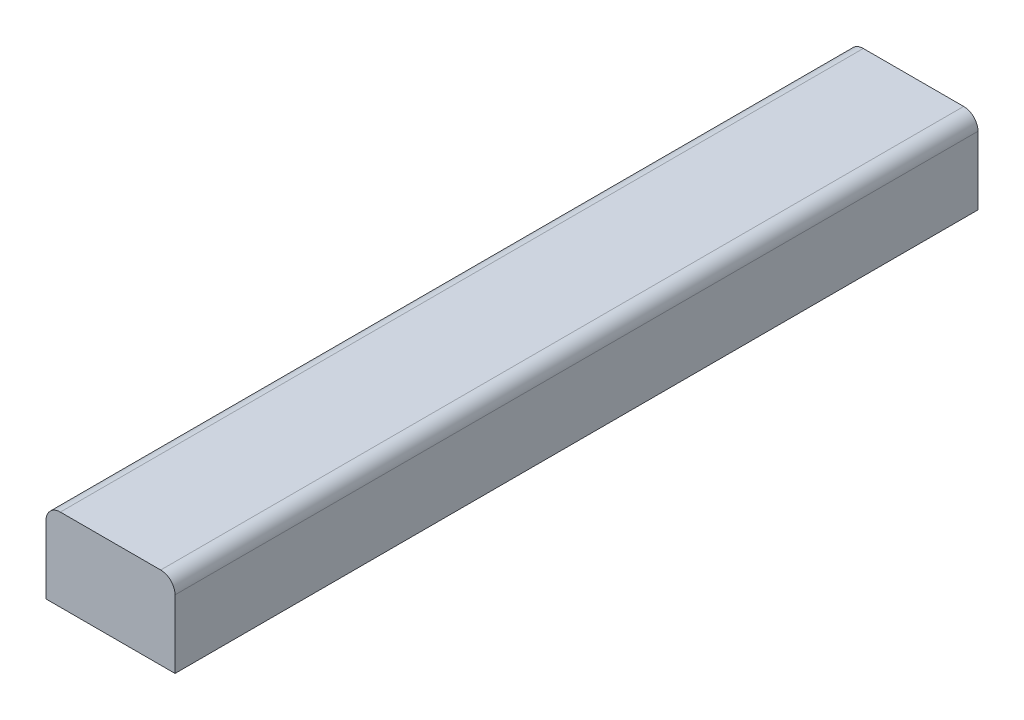
ISO-10303-21;
HEADER;
FILE_DESCRIPTION(('STEP AP214'),'2;1');
FILE_NAME('part.step','',(''),(''),'','','');
FILE_SCHEMA(('AUTOMOTIVE_DESIGN { 1 0 10303 214 1 1 1 1 }'));
ENDSEC;
DATA;
#1=APPLICATION_CONTEXT('core data for automotive mechanical design processes');
#2=APPLICATION_PROTOCOL_DEFINITION('international standard','automotive_design',2000,#1);
#3=PRODUCT_CONTEXT('',#1,'mechanical');
#4=PRODUCT('Part','Part','',(#3));
#5=PRODUCT_RELATED_PRODUCT_CATEGORY('part','',(#4));
#6=PRODUCT_DEFINITION_FORMATION('','',#4);
#7=PRODUCT_DEFINITION_CONTEXT('part definition',#1,'design');
#8=PRODUCT_DEFINITION('design','',#6,#7);
#9=PRODUCT_DEFINITION_SHAPE('','',#8);
#10=(LENGTH_UNIT() NAMED_UNIT(*) SI_UNIT(.MILLI.,.METRE.));
#11=(NAMED_UNIT(*) PLANE_ANGLE_UNIT() SI_UNIT($,.RADIAN.));
#12=(NAMED_UNIT(*) SI_UNIT($,.STERADIAN.) SOLID_ANGLE_UNIT());
#13=UNCERTAINTY_MEASURE_WITH_UNIT(LENGTH_MEASURE(1.E-05),#10,'distance_accuracy_value','');
#14=(GEOMETRIC_REPRESENTATION_CONTEXT(3) GLOBAL_UNCERTAINTY_ASSIGNED_CONTEXT((#13)) GLOBAL_UNIT_ASSIGNED_CONTEXT((#10,
#11,#12)) REPRESENTATION_CONTEXT('',''));
#15=CARTESIAN_POINT('',(0.,0.,0.));
#16=DIRECTION('',(0.,0.,1.));
#17=DIRECTION('',(1.,0.,0.));
#18=AXIS2_PLACEMENT_3D('',#15,#16,#17);
#19=CARTESIAN_POINT('',(57.15,36.5125,711.2));
#20=DIRECTION('',(0.,-1.,0.));
#21=DIRECTION('',(0.,0.,-1.));
#22=AXIS2_PLACEMENT_3D('',#19,#20,#21);
#23=PLANE('',#22);
#24=DIRECTION('',(-1.,0.,0.));
#25=VECTOR('',#24,1.);
#26=CARTESIAN_POINT('',(57.15,36.5125,0.));
#27=LINE('',#26,#25);
#28=CARTESIAN_POINT('',(44.45,36.5125,0.));
#29=VERTEX_POINT('',#28);
#30=CARTESIAN_POINT('',(-44.45,36.5125,0.));
#31=VERTEX_POINT('',#30);
#32=EDGE_CURVE('E133',#29,#31,#27,.T.);
#33=ORIENTED_EDGE('',*,*,#32,.T.);
#34=DIRECTION('',(0.,0.,-1.));
#35=VECTOR('',#34,1.);
#36=CARTESIAN_POINT('',(-44.45,36.5125,711.2));
#37=LINE('',#36,#35);
#38=CARTESIAN_POINT('',(-44.45,36.5125,711.2));
#39=VERTEX_POINT('',#38);
#40=EDGE_CURVE('E67',#31,#39,#37,.F.);
#41=ORIENTED_EDGE('',*,*,#40,.T.);
#42=DIRECTION('',(-1.,0.,0.));
#43=VECTOR('',#42,1.);
#44=CARTESIAN_POINT('',(57.15,36.5125,711.2));
#45=LINE('',#44,#43);
#46=CARTESIAN_POINT('',(44.45,36.5125,711.2));
#47=VERTEX_POINT('',#46);
#48=EDGE_CURVE('E111',#47,#39,#45,.T.);
#49=ORIENTED_EDGE('',*,*,#48,.F.);
#50=DIRECTION('',(0.,0.,-1.));
#51=VECTOR('',#50,1.);
#52=CARTESIAN_POINT('',(44.45,36.5125,711.2));
#53=LINE('',#52,#51);
#54=EDGE_CURVE('E154',#47,#29,#53,.T.);
#55=ORIENTED_EDGE('',*,*,#54,.T.);
#56=EDGE_LOOP('',(#33,#41,#49,#55));
#57=FACE_BOUND('',#56,.T.);
#58=ADVANCED_FACE('F45',(#57),#23,.F.);
#59=CARTESIAN_POINT('',(-57.15,-36.5125,711.2));
#60=DIRECTION('',(1.,0.,0.));
#61=DIRECTION('',(0.,0.,-1.));
#62=AXIS2_PLACEMENT_3D('',#59,#60,#61);
#63=PLANE('',#62);
#64=DIRECTION('',(0.,-1.,0.));
#65=VECTOR('',#64,1.);
#66=CARTESIAN_POINT('',(-57.15,-36.5125,711.2));
#67=LINE('',#66,#65);
#68=CARTESIAN_POINT('',(-57.15,23.8125,711.2));
#69=VERTEX_POINT('',#68);
#70=CARTESIAN_POINT('',(-57.15,-36.5125,711.2));
#71=VERTEX_POINT('',#70);
#72=EDGE_CURVE('E100',#69,#71,#67,.T.);
#73=ORIENTED_EDGE('',*,*,#72,.F.);
#74=DIRECTION('',(0.,0.,-1.));
#75=VECTOR('',#74,1.);
#76=CARTESIAN_POINT('',(-57.15,23.8125,711.2));
#77=LINE('',#76,#75);
#78=CARTESIAN_POINT('',(-57.15,23.8125,0.));
#79=VERTEX_POINT('',#78);
#80=EDGE_CURVE('E121',#69,#79,#77,.T.);
#81=ORIENTED_EDGE('',*,*,#80,.T.);
#82=DIRECTION('',(0.,-1.,0.));
#83=VECTOR('',#82,1.);
#84=CARTESIAN_POINT('',(-57.15,-36.5125,0.));
#85=LINE('',#84,#83);
#86=CARTESIAN_POINT('',(-57.15,-36.5125,0.));
#87=VERTEX_POINT('',#86);
#88=EDGE_CURVE('E117',#79,#87,#85,.T.);
#89=ORIENTED_EDGE('',*,*,#88,.T.);
#90=DIRECTION('',(0.,0.,-1.));
#91=VECTOR('',#90,1.);
#92=CARTESIAN_POINT('',(-57.15,-36.5125,711.2));
#93=LINE('',#92,#91);
#94=EDGE_CURVE('E114',#71,#87,#93,.T.);
#95=ORIENTED_EDGE('',*,*,#94,.F.);
#96=EDGE_LOOP('',(#73,#81,#89,#95));
#97=FACE_BOUND('',#96,.T.);
#98=ADVANCED_FACE('F115',(#97),#63,.F.);
#99=CARTESIAN_POINT('',(57.15,-36.5125,711.2));
#100=DIRECTION('',(0.,1.,0.));
#101=DIRECTION('',(0.,0.,1.));
#102=AXIS2_PLACEMENT_3D('',#99,#100,#101);
#103=PLANE('',#102);
#104=DIRECTION('',(1.,0.,0.));
#105=VECTOR('',#104,1.);
#106=CARTESIAN_POINT('',(57.15,-36.5125,0.));
#107=LINE('',#106,#105);
#108=CARTESIAN_POINT('',(57.15,-36.5125,0.));
#109=VERTEX_POINT('',#108);
#110=EDGE_CURVE('E138',#87,#109,#107,.T.);
#111=ORIENTED_EDGE('',*,*,#110,.T.);
#112=DIRECTION('',(0.,0.,-1.));
#113=VECTOR('',#112,1.);
#114=CARTESIAN_POINT('',(57.15,-36.5125,711.2));
#115=LINE('',#114,#113);
#116=CARTESIAN_POINT('',(57.15,-36.5125,711.2));
#117=VERTEX_POINT('',#116);
#118=EDGE_CURVE('E122',#117,#109,#115,.T.);
#119=ORIENTED_EDGE('',*,*,#118,.F.);
#120=DIRECTION('',(1.,0.,0.));
#121=VECTOR('',#120,1.);
#122=CARTESIAN_POINT('',(57.15,-36.5125,711.2));
#123=LINE('',#122,#121);
#124=EDGE_CURVE('E104',#71,#117,#123,.T.);
#125=ORIENTED_EDGE('',*,*,#124,.F.);
#126=ORIENTED_EDGE('',*,*,#94,.T.);
#127=EDGE_LOOP('',(#111,#119,#125,#126));
#128=FACE_BOUND('',#127,.T.);
#129=ADVANCED_FACE('F124',(#128),#103,.F.);
#130=CARTESIAN_POINT('',(57.15,-36.5125,711.2));
#131=DIRECTION('',(-1.,0.,0.));
#132=DIRECTION('',(0.,0.,1.));
#133=AXIS2_PLACEMENT_3D('',#130,#131,#132);
#134=PLANE('',#133);
#135=DIRECTION('',(0.,1.,0.));
#136=VECTOR('',#135,1.);
#137=CARTESIAN_POINT('',(57.15,-36.5125,0.));
#138=LINE('',#137,#136);
#139=CARTESIAN_POINT('',(57.15,23.8125,0.));
#140=VERTEX_POINT('',#139);
#141=EDGE_CURVE('E141',#109,#140,#138,.T.);
#142=ORIENTED_EDGE('',*,*,#141,.T.);
#143=DIRECTION('',(0.,0.,-1.));
#144=VECTOR('',#143,1.);
#145=CARTESIAN_POINT('',(57.15,23.8125,711.2));
#146=LINE('',#145,#144);
#147=CARTESIAN_POINT('',(57.15,23.8125,711.2));
#148=VERTEX_POINT('',#147);
#149=EDGE_CURVE('E11',#140,#148,#146,.F.);
#150=ORIENTED_EDGE('',*,*,#149,.T.);
#151=DIRECTION('',(0.,1.,0.));
#152=VECTOR('',#151,1.);
#153=CARTESIAN_POINT('',(57.15,-36.5125,711.2));
#154=LINE('',#153,#152);
#155=EDGE_CURVE('E127',#117,#148,#154,.T.);
#156=ORIENTED_EDGE('',*,*,#155,.F.);
#157=ORIENTED_EDGE('',*,*,#118,.T.);
#158=EDGE_LOOP('',(#142,#150,#156,#157));
#159=FACE_BOUND('',#158,.T.);
#160=ADVANCED_FACE('F171',(#159),#134,.F.);
#161=CARTESIAN_POINT('',(0.,0.,711.2));
#162=DIRECTION('',(0.,0.,-1.));
#163=DIRECTION('',(-1.,0.,0.));
#164=AXIS2_PLACEMENT_3D('',#161,#162,#163);
#165=PLANE('',#164);
#166=ORIENTED_EDGE('',*,*,#48,.T.);
#167=CARTESIAN_POINT('',(-44.45,23.8125,711.2));
#168=DIRECTION('',(0.,0.,-1.));
#169=DIRECTION('',(-1.,0.,0.));
#170=AXIS2_PLACEMENT_3D('',#167,#168,#169);
#171=CIRCLE('',#170,12.7);
#172=EDGE_CURVE('E54',#39,#69,#171,.F.);
#173=ORIENTED_EDGE('',*,*,#172,.T.);
#174=ORIENTED_EDGE('',*,*,#72,.T.);
#175=ORIENTED_EDGE('',*,*,#124,.T.);
#176=ORIENTED_EDGE('',*,*,#155,.T.);
#177=CARTESIAN_POINT('',(44.45,23.8125,711.2));
#178=DIRECTION('',(0.,0.,-1.));
#179=DIRECTION('',(-1.,0.,0.));
#180=AXIS2_PLACEMENT_3D('',#177,#178,#179);
#181=CIRCLE('',#180,12.7);
#182=EDGE_CURVE('E160',#148,#47,#181,.F.);
#183=ORIENTED_EDGE('',*,*,#182,.T.);
#184=EDGE_LOOP('',(#166,#173,#174,#175,#176,#183));
#185=FACE_BOUND('',#184,.T.);
#186=ADVANCED_FACE('F102',(#185),#165,.F.);
#187=CARTESIAN_POINT('',(0.,0.,0.));
#188=DIRECTION('',(0.,0.,-1.));
#189=DIRECTION('',(-1.,0.,0.));
#190=AXIS2_PLACEMENT_3D('',#187,#188,#189);
#191=PLANE('',#190);
#192=ORIENTED_EDGE('',*,*,#88,.F.);
#193=CARTESIAN_POINT('',(-44.45,23.8125,0.));
#194=DIRECTION('',(0.,0.,-1.));
#195=DIRECTION('',(-1.,0.,0.));
#196=AXIS2_PLACEMENT_3D('',#193,#194,#195);
#197=CIRCLE('',#196,12.7);
#198=EDGE_CURVE('E151',#79,#31,#197,.T.);
#199=ORIENTED_EDGE('',*,*,#198,.T.);
#200=ORIENTED_EDGE('',*,*,#32,.F.);
#201=CARTESIAN_POINT('',(44.45,23.8125,0.));
#202=DIRECTION('',(0.,0.,-1.));
#203=DIRECTION('',(-1.,0.,0.));
#204=AXIS2_PLACEMENT_3D('',#201,#202,#203);
#205=CIRCLE('',#204,12.7);
#206=EDGE_CURVE('E148',#29,#140,#205,.T.);
#207=ORIENTED_EDGE('',*,*,#206,.T.);
#208=ORIENTED_EDGE('',*,*,#141,.F.);
#209=ORIENTED_EDGE('',*,*,#110,.F.);
#210=EDGE_LOOP('',(#192,#199,#200,#207,#208,#209));
#211=FACE_BOUND('',#210,.T.);
#212=ADVANCED_FACE('F170',(#211),#191,.T.);
#213=CARTESIAN_POINT('',(-44.45,23.8125,711.2));
#214=DIRECTION('',(0.,0.,-1.));
#215=DIRECTION('',(-1.,0.,0.));
#216=AXIS2_PLACEMENT_3D('',#213,#214,#215);
#217=CYLINDRICAL_SURFACE('',#216,12.7);
#218=ORIENTED_EDGE('',*,*,#172,.F.);
#219=ORIENTED_EDGE('',*,*,#40,.F.);
#220=ORIENTED_EDGE('',*,*,#198,.F.);
#221=ORIENTED_EDGE('',*,*,#80,.F.);
#222=EDGE_LOOP('',(#218,#219,#220,#221));
#223=FACE_BOUND('',#222,.T.);
#224=ADVANCED_FACE('F187',(#223),#217,.T.);
#225=CARTESIAN_POINT('',(44.45,23.8125,711.2));
#226=DIRECTION('',(0.,0.,-1.));
#227=DIRECTION('',(-1.,0.,0.));
#228=AXIS2_PLACEMENT_3D('',#225,#226,#227);
#229=CYLINDRICAL_SURFACE('',#228,12.7);
#230=ORIENTED_EDGE('',*,*,#182,.F.);
#231=ORIENTED_EDGE('',*,*,#149,.F.);
#232=ORIENTED_EDGE('',*,*,#206,.F.);
#233=ORIENTED_EDGE('',*,*,#54,.F.);
#234=EDGE_LOOP('',(#230,#231,#232,#233));
#235=FACE_BOUND('',#234,.T.);
#236=ADVANCED_FACE('F47',(#235),#229,.T.);
#237=CLOSED_SHELL('',(#58,#98,#129,#160,#186,#212,#224,#236));
#238=MANIFOLD_SOLID_BREP('B2',#237);
#239=ADVANCED_BREP_SHAPE_REPRESENTATION('',(#18,#238),#14);
#240=SHAPE_DEFINITION_REPRESENTATION(#9,#239);
ENDSEC;
END-ISO-10303-21;
